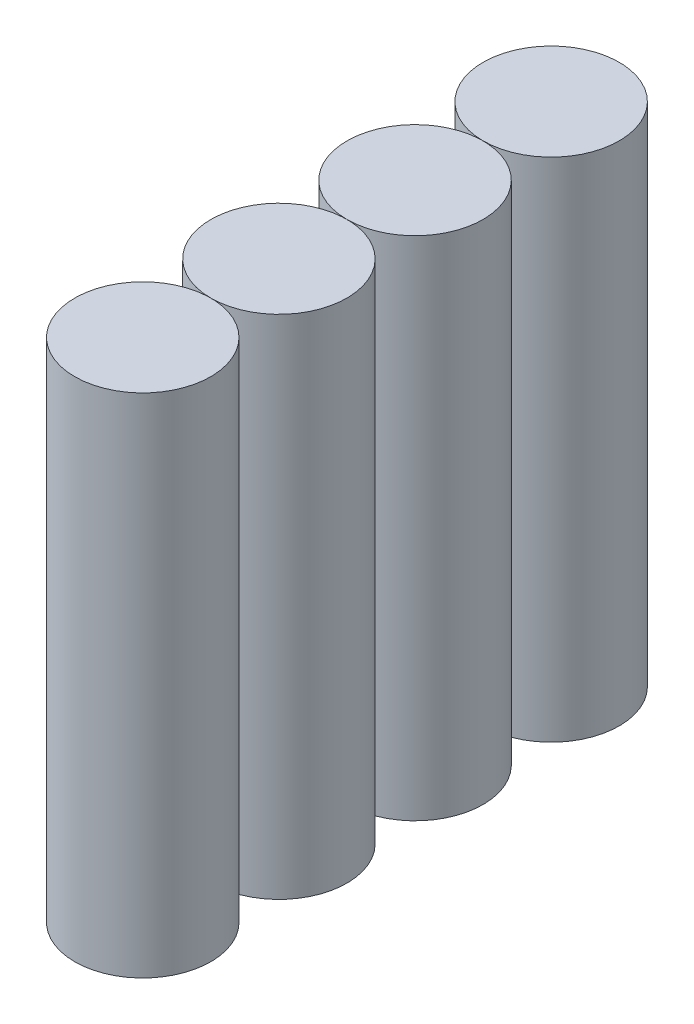
ISO-10303-21;
HEADER;
FILE_DESCRIPTION(('STEP AP214'),'2;1');
FILE_NAME('part.step','',(''),(''),'','','');
FILE_SCHEMA(('AUTOMOTIVE_DESIGN { 1 0 10303 214 1 1 1 1 }'));
ENDSEC;
DATA;
#1=APPLICATION_CONTEXT('core data for automotive mechanical design processes');
#2=APPLICATION_PROTOCOL_DEFINITION('international standard','automotive_design',2000,#1);
#3=PRODUCT_CONTEXT('',#1,'mechanical');
#4=PRODUCT('Part','Part','',(#3));
#5=PRODUCT_RELATED_PRODUCT_CATEGORY('part','',(#4));
#6=PRODUCT_DEFINITION_FORMATION('','',#4);
#7=PRODUCT_DEFINITION_CONTEXT('part definition',#1,'design');
#8=PRODUCT_DEFINITION('design','',#6,#7);
#9=PRODUCT_DEFINITION_SHAPE('','',#8);
#10=(LENGTH_UNIT() NAMED_UNIT(*) SI_UNIT(.MILLI.,.METRE.));
#11=(NAMED_UNIT(*) PLANE_ANGLE_UNIT() SI_UNIT($,.RADIAN.));
#12=(NAMED_UNIT(*) SI_UNIT($,.STERADIAN.) SOLID_ANGLE_UNIT());
#13=UNCERTAINTY_MEASURE_WITH_UNIT(LENGTH_MEASURE(1.E-05),#10,'distance_accuracy_value','');
#14=(GEOMETRIC_REPRESENTATION_CONTEXT(3) GLOBAL_UNCERTAINTY_ASSIGNED_CONTEXT((#13)) GLOBAL_UNIT_ASSIGNED_CONTEXT((#10,
#11,#12)) REPRESENTATION_CONTEXT('',''));
#15=CARTESIAN_POINT('',(0.,0.,0.));
#16=DIRECTION('',(0.,0.,1.));
#17=DIRECTION('',(1.,0.,0.));
#18=AXIS2_PLACEMENT_3D('',#15,#16,#17);
#19=CARTESIAN_POINT('',(-16.3681684566047,-67.,64.5652749040021));
#20=DIRECTION('',(0.,1.,0.));
#21=DIRECTION('',(0.,0.,1.));
#22=AXIS2_PLACEMENT_3D('',#19,#20,#21);
#23=CYLINDRICAL_SURFACE('',#22,9.00000000000003);
#24=CARTESIAN_POINT('',(-16.3681684566047,0.,64.5652749040021));
#25=DIRECTION('',(0.,1.,0.));
#26=DIRECTION('',(0.,0.,1.));
#27=AXIS2_PLACEMENT_3D('',#24,#25,#26);
#28=CIRCLE('',#27,9.00000000000003);
#29=CARTESIAN_POINT('',(-16.3681684566047,0.,73.5652749040022));
#30=VERTEX_POINT('',#29);
#31=EDGE_CURVE('E12',#30,#30,#28,.T.);
#32=ORIENTED_EDGE('',*,*,#31,.F.);
#33=EDGE_LOOP('',(#32));
#34=FACE_BOUND('',#33,.T.);
#35=CARTESIAN_POINT('',(-16.3681684566047,-67.,64.5652749040021));
#36=DIRECTION('',(0.,1.,0.));
#37=DIRECTION('',(0.,0.,1.));
#38=AXIS2_PLACEMENT_3D('',#35,#36,#37);
#39=CIRCLE('',#38,9.00000000000003);
#40=CARTESIAN_POINT('',(-16.3681684566047,-67.,73.5652749040022));
#41=VERTEX_POINT('',#40);
#42=EDGE_CURVE('E72',#41,#41,#39,.T.);
#43=ORIENTED_EDGE('',*,*,#42,.T.);
#44=EDGE_LOOP('',(#43));
#45=FACE_BOUND('',#44,.T.);
#46=ADVANCED_FACE('F68',(#34,#45),#23,.T.);
#47=CARTESIAN_POINT('',(0.,-67.,0.));
#48=DIRECTION('',(0.,1.,0.));
#49=DIRECTION('',(0.,0.,1.));
#50=AXIS2_PLACEMENT_3D('',#47,#48,#49);
#51=PLANE('',#50);
#52=ORIENTED_EDGE('',*,*,#42,.F.);
#53=EDGE_LOOP('',(#52));
#54=FACE_BOUND('',#53,.T.);
#55=ADVANCED_FACE('F70',(#54),#51,.F.);
#56=CARTESIAN_POINT('',(0.,0.,0.));
#57=DIRECTION('',(0.,1.,0.));
#58=DIRECTION('',(0.,0.,1.));
#59=AXIS2_PLACEMENT_3D('',#56,#57,#58);
#60=PLANE('',#59);
#61=ORIENTED_EDGE('',*,*,#31,.T.);
#62=EDGE_LOOP('',(#61));
#63=FACE_BOUND('',#62,.T.);
#64=ADVANCED_FACE('F85',(#63),#60,.T.);
#65=CLOSED_SHELL('',(#46,#55,#64));
#66=MANIFOLD_SOLID_BREP('B2',#65);
#67=CARTESIAN_POINT('',(-16.3681684566047,-67.,46.5652749040021));
#68=DIRECTION('',(0.,1.,0.));
#69=DIRECTION('',(0.,0.,1.));
#70=AXIS2_PLACEMENT_3D('',#67,#68,#69);
#71=CYLINDRICAL_SURFACE('',#70,9.00000000000002);
#72=CARTESIAN_POINT('',(-16.3681684566047,0.,46.5652749040021));
#73=DIRECTION('',(0.,1.,0.));
#74=DIRECTION('',(0.,0.,1.));
#75=AXIS2_PLACEMENT_3D('',#72,#73,#74);
#76=CIRCLE('',#75,9.00000000000002);
#77=CARTESIAN_POINT('',(-16.3681684566047,0.,55.5652749040022));
#78=VERTEX_POINT('',#77);
#79=EDGE_CURVE('E67',#78,#78,#76,.T.);
#80=ORIENTED_EDGE('',*,*,#79,.F.);
#81=EDGE_LOOP('',(#80));
#82=FACE_BOUND('',#81,.T.);
#83=CARTESIAN_POINT('',(-16.3681684566047,-67.,46.5652749040021));
#84=DIRECTION('',(0.,1.,0.));
#85=DIRECTION('',(0.,0.,1.));
#86=AXIS2_PLACEMENT_3D('',#83,#84,#85);
#87=CIRCLE('',#86,9.00000000000002);
#88=CARTESIAN_POINT('',(-16.3681684566047,-67.,55.5652749040022));
#89=VERTEX_POINT('',#88);
#90=EDGE_CURVE('E123',#89,#89,#87,.T.);
#91=ORIENTED_EDGE('',*,*,#90,.T.);
#92=EDGE_LOOP('',(#91));
#93=FACE_BOUND('',#92,.T.);
#94=ADVANCED_FACE('F119',(#82,#93),#71,.T.);
#95=CARTESIAN_POINT('',(0.,-67.,0.));
#96=DIRECTION('',(0.,1.,0.));
#97=DIRECTION('',(0.,0.,1.));
#98=AXIS2_PLACEMENT_3D('',#95,#96,#97);
#99=PLANE('',#98);
#100=ORIENTED_EDGE('',*,*,#90,.F.);
#101=EDGE_LOOP('',(#100));
#102=FACE_BOUND('',#101,.T.);
#103=ADVANCED_FACE('F121',(#102),#99,.F.);
#104=CARTESIAN_POINT('',(0.,0.,0.));
#105=DIRECTION('',(0.,1.,0.));
#106=DIRECTION('',(0.,0.,1.));
#107=AXIS2_PLACEMENT_3D('',#104,#105,#106);
#108=PLANE('',#107);
#109=ORIENTED_EDGE('',*,*,#79,.T.);
#110=EDGE_LOOP('',(#109));
#111=FACE_BOUND('',#110,.T.);
#112=ADVANCED_FACE('F134',(#111),#108,.T.);
#113=CLOSED_SHELL('',(#94,#103,#112));
#114=MANIFOLD_SOLID_BREP('B7',#113);
#115=CARTESIAN_POINT('',(-16.3681684566047,-67.,28.5652749040021));
#116=DIRECTION('',(0.,1.,0.));
#117=DIRECTION('',(0.,0.,1.));
#118=AXIS2_PLACEMENT_3D('',#115,#116,#117);
#119=CYLINDRICAL_SURFACE('',#118,9.00000000000002);
#120=CARTESIAN_POINT('',(-16.3681684566047,0.,28.5652749040021));
#121=DIRECTION('',(0.,1.,0.));
#122=DIRECTION('',(0.,0.,1.));
#123=AXIS2_PLACEMENT_3D('',#120,#121,#122);
#124=CIRCLE('',#123,9.00000000000002);
#125=CARTESIAN_POINT('',(-16.3681684566047,0.,37.5652749040021));
#126=VERTEX_POINT('',#125);
#127=EDGE_CURVE('E118',#126,#126,#124,.T.);
#128=ORIENTED_EDGE('',*,*,#127,.F.);
#129=EDGE_LOOP('',(#128));
#130=FACE_BOUND('',#129,.T.);
#131=CARTESIAN_POINT('',(-16.3681684566047,-67.,28.5652749040021));
#132=DIRECTION('',(0.,1.,0.));
#133=DIRECTION('',(0.,0.,1.));
#134=AXIS2_PLACEMENT_3D('',#131,#132,#133);
#135=CIRCLE('',#134,9.00000000000002);
#136=CARTESIAN_POINT('',(-16.3681684566047,-67.,37.5652749040021));
#137=VERTEX_POINT('',#136);
#138=EDGE_CURVE('E171',#137,#137,#135,.T.);
#139=ORIENTED_EDGE('',*,*,#138,.T.);
#140=EDGE_LOOP('',(#139));
#141=FACE_BOUND('',#140,.T.);
#142=ADVANCED_FACE('F167',(#130,#141),#119,.T.);
#143=CARTESIAN_POINT('',(0.,-67.,0.));
#144=DIRECTION('',(0.,1.,0.));
#145=DIRECTION('',(0.,0.,1.));
#146=AXIS2_PLACEMENT_3D('',#143,#144,#145);
#147=PLANE('',#146);
#148=ORIENTED_EDGE('',*,*,#138,.F.);
#149=EDGE_LOOP('',(#148));
#150=FACE_BOUND('',#149,.T.);
#151=ADVANCED_FACE('F169',(#150),#147,.F.);
#152=CARTESIAN_POINT('',(0.,0.,0.));
#153=DIRECTION('',(0.,1.,0.));
#154=DIRECTION('',(0.,0.,1.));
#155=AXIS2_PLACEMENT_3D('',#152,#153,#154);
#156=PLANE('',#155);
#157=ORIENTED_EDGE('',*,*,#127,.T.);
#158=EDGE_LOOP('',(#157));
#159=FACE_BOUND('',#158,.T.);
#160=ADVANCED_FACE('F182',(#159),#156,.T.);
#161=CLOSED_SHELL('',(#142,#151,#160));
#162=MANIFOLD_SOLID_BREP('B62',#161);
#163=CARTESIAN_POINT('',(-16.3681684566047,-67.,10.5652749040021));
#164=DIRECTION('',(0.,1.,0.));
#165=DIRECTION('',(0.,0.,1.));
#166=AXIS2_PLACEMENT_3D('',#163,#164,#165);
#167=CYLINDRICAL_SURFACE('',#166,9.00000000000001);
#168=CARTESIAN_POINT('',(-16.3681684566047,0.,10.5652749040021));
#169=DIRECTION('',(0.,1.,0.));
#170=DIRECTION('',(0.,0.,1.));
#171=AXIS2_PLACEMENT_3D('',#168,#169,#170);
#172=CIRCLE('',#171,9.00000000000001);
#173=CARTESIAN_POINT('',(-16.3681684566047,0.,19.5652749040021));
#174=VERTEX_POINT('',#173);
#175=EDGE_CURVE('E211',#174,#174,#172,.T.);
#176=ORIENTED_EDGE('',*,*,#175,.F.);
#177=EDGE_LOOP('',(#176));
#178=FACE_BOUND('',#177,.T.);
#179=CARTESIAN_POINT('',(-16.3681684566047,-67.,10.5652749040021));
#180=DIRECTION('',(0.,1.,0.));
#181=DIRECTION('',(0.,0.,1.));
#182=AXIS2_PLACEMENT_3D('',#179,#180,#181);
#183=CIRCLE('',#182,9.00000000000001);
#184=CARTESIAN_POINT('',(-16.3681684566047,-67.,19.5652749040021));
#185=VERTEX_POINT('',#184);
#186=EDGE_CURVE('E166',#185,#185,#183,.T.);
#187=ORIENTED_EDGE('',*,*,#186,.T.);
#188=EDGE_LOOP('',(#187));
#189=FACE_BOUND('',#188,.T.);
#190=ADVANCED_FACE('F208',(#178,#189),#167,.T.);
#191=CARTESIAN_POINT('',(0.,-67.,0.));
#192=DIRECTION('',(0.,1.,0.));
#193=DIRECTION('',(0.,0.,1.));
#194=AXIS2_PLACEMENT_3D('',#191,#192,#193);
#195=PLANE('',#194);
#196=ORIENTED_EDGE('',*,*,#186,.F.);
#197=EDGE_LOOP('',(#196));
#198=FACE_BOUND('',#197,.T.);
#199=ADVANCED_FACE('F223',(#198),#195,.F.);
#200=CARTESIAN_POINT('',(0.,0.,0.));
#201=DIRECTION('',(0.,1.,0.));
#202=DIRECTION('',(0.,0.,1.));
#203=AXIS2_PLACEMENT_3D('',#200,#201,#202);
#204=PLANE('',#203);
#205=ORIENTED_EDGE('',*,*,#175,.T.);
#206=EDGE_LOOP('',(#205));
#207=FACE_BOUND('',#206,.T.);
#208=ADVANCED_FACE('F220',(#207),#204,.T.);
#209=CLOSED_SHELL('',(#190,#199,#208));
#210=MANIFOLD_SOLID_BREP('B113',#209);
#211=ADVANCED_BREP_SHAPE_REPRESENTATION('',(#18,#66,#114,#162,#210),#14);
#212=SHAPE_DEFINITION_REPRESENTATION(#9,#211);
ENDSEC;
END-ISO-10303-21;
